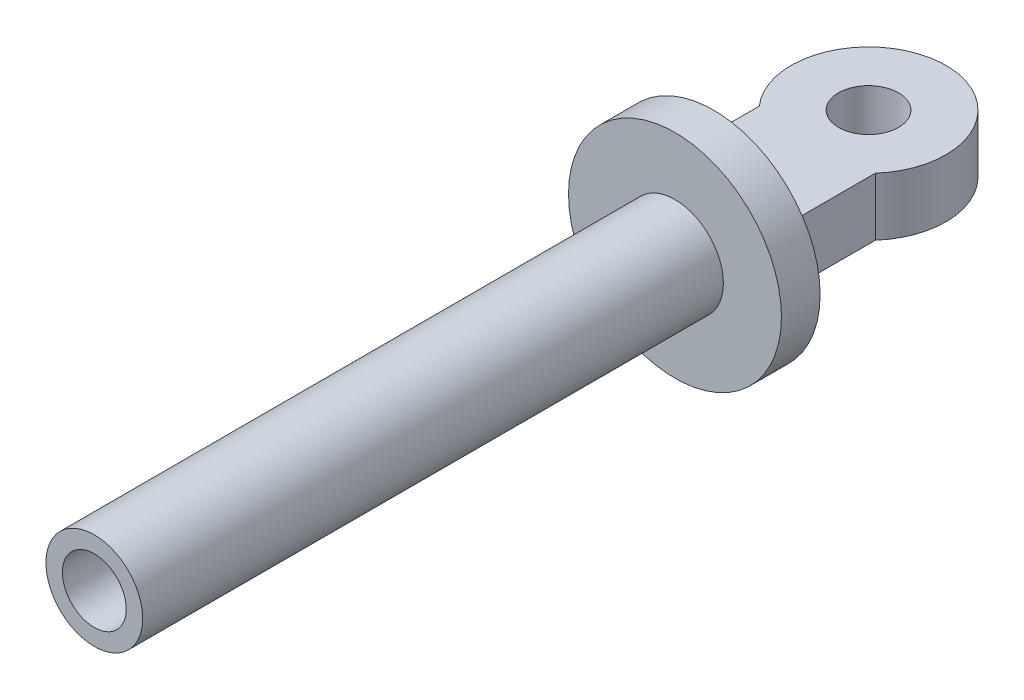
ISO-10303-21;
HEADER;
FILE_DESCRIPTION(('STEP AP214'),'2;1');
FILE_NAME('part.step','',(''),(''),'','','');
FILE_SCHEMA(('AUTOMOTIVE_DESIGN { 1 0 10303 214 1 1 1 1 }'));
ENDSEC;
DATA;
#1=APPLICATION_CONTEXT('core data for automotive mechanical design processes');
#2=APPLICATION_PROTOCOL_DEFINITION('international standard','automotive_design',2000,#1);
#3=PRODUCT_CONTEXT('',#1,'mechanical');
#4=PRODUCT('Part','Part','',(#3));
#5=PRODUCT_RELATED_PRODUCT_CATEGORY('part','',(#4));
#6=PRODUCT_DEFINITION_FORMATION('','',#4);
#7=PRODUCT_DEFINITION_CONTEXT('part definition',#1,'design');
#8=PRODUCT_DEFINITION('design','',#6,#7);
#9=PRODUCT_DEFINITION_SHAPE('','',#8);
#10=(LENGTH_UNIT() NAMED_UNIT(*) SI_UNIT(.MILLI.,.METRE.));
#11=(NAMED_UNIT(*) PLANE_ANGLE_UNIT() SI_UNIT($,.RADIAN.));
#12=(NAMED_UNIT(*) SI_UNIT($,.STERADIAN.) SOLID_ANGLE_UNIT());
#13=UNCERTAINTY_MEASURE_WITH_UNIT(LENGTH_MEASURE(1.E-05),#10,'distance_accuracy_value','');
#14=(GEOMETRIC_REPRESENTATION_CONTEXT(3) GLOBAL_UNCERTAINTY_ASSIGNED_CONTEXT((#13)) GLOBAL_UNIT_ASSIGNED_CONTEXT((#10,
#11,#12)) REPRESENTATION_CONTEXT('',''));
#15=CARTESIAN_POINT('',(0.,0.,0.));
#16=DIRECTION('',(0.,0.,1.));
#17=DIRECTION('',(1.,0.,0.));
#18=AXIS2_PLACEMENT_3D('',#15,#16,#17);
#19=CARTESIAN_POINT('',(0.,0.,25.));
#20=DIRECTION('',(0.,0.,1.));
#21=DIRECTION('',(1.,0.,0.));
#22=AXIS2_PLACEMENT_3D('',#19,#20,#21);
#23=PLANE('',#22);
#24=CARTESIAN_POINT('',(0.,0.,25.));
#25=DIRECTION('',(0.,0.,1.));
#26=DIRECTION('',(1.,0.,0.));
#27=AXIS2_PLACEMENT_3D('',#24,#25,#26);
#28=CIRCLE('',#27,3.3);
#29=CARTESIAN_POINT('',(3.3,0.,25.));
#30=VERTEX_POINT('',#29);
#31=EDGE_CURVE('E11',#30,#30,#28,.T.);
#32=ORIENTED_EDGE('',*,*,#31,.T.);
#33=EDGE_LOOP('',(#32));
#34=FACE_BOUND('',#33,.T.);
#35=ADVANCED_FACE('F16',(#34),#23,.T.);
#36=CARTESIAN_POINT('',(0.,0.,25.));
#37=DIRECTION('',(0.,0.,1.));
#38=DIRECTION('',(1.,0.,0.));
#39=AXIS2_PLACEMENT_3D('',#36,#37,#38);
#40=CYLINDRICAL_SURFACE('',#39,3.3);
#41=DIRECTION('',(0.,0.,1.));
#42=VECTOR('',#41,1.);
#43=CARTESIAN_POINT('',(3.3,0.,25.));
#44=LINE('',#43,#42);
#45=CARTESIAN_POINT('',(3.3,0.,80.));
#46=VERTEX_POINT('',#45);
#47=EDGE_CURVE('E25',#30,#46,#44,.T.);
#48=ORIENTED_EDGE('',*,*,#47,.F.);
#49=ORIENTED_EDGE('',*,*,#31,.F.);
#50=ORIENTED_EDGE('',*,*,#47,.T.);
#51=CARTESIAN_POINT('',(0.,0.,80.));
#52=DIRECTION('',(0.,0.,1.));
#53=DIRECTION('',(1.,0.,0.));
#54=AXIS2_PLACEMENT_3D('',#51,#52,#53);
#55=CIRCLE('',#54,3.3);
#56=EDGE_CURVE('E77',#46,#46,#55,.T.);
#57=ORIENTED_EDGE('',*,*,#56,.T.);
#58=EDGE_LOOP('',(#48,#49,#50,#57));
#59=FACE_BOUND('',#58,.T.);
#60=ADVANCED_FACE('F97',(#59),#40,.F.);
#61=CARTESIAN_POINT('',(0.,5.,0.));
#62=DIRECTION('',(0.,-1.,0.));
#63=DIRECTION('',(1.,0.,0.));
#64=AXIS2_PLACEMENT_3D('',#61,#62,#63);
#65=CYLINDRICAL_SURFACE('',#64,3.1);
#66=DIRECTION('',(0.,-1.,0.));
#67=VECTOR('',#66,1.);
#68=CARTESIAN_POINT('',(3.1,5.,0.));
#69=LINE('',#68,#67);
#70=CARTESIAN_POINT('',(3.1,3.,0.));
#71=VERTEX_POINT('',#70);
#72=CARTESIAN_POINT('',(3.1,-3.,0.));
#73=VERTEX_POINT('',#72);
#74=EDGE_CURVE('E70',#71,#73,#69,.T.);
#75=ORIENTED_EDGE('',*,*,#74,.F.);
#76=CARTESIAN_POINT('',(0.,3.,0.));
#77=DIRECTION('',(0.,-1.,0.));
#78=DIRECTION('',(1.,0.,0.));
#79=AXIS2_PLACEMENT_3D('',#76,#77,#78);
#80=CIRCLE('',#79,3.1);
#81=EDGE_CURVE('E73',#71,#71,#80,.T.);
#82=ORIENTED_EDGE('',*,*,#81,.F.);
#83=ORIENTED_EDGE('',*,*,#74,.T.);
#84=CARTESIAN_POINT('',(0.,-3.,0.));
#85=DIRECTION('',(0.,-1.,0.));
#86=DIRECTION('',(1.,0.,0.));
#87=AXIS2_PLACEMENT_3D('',#84,#85,#86);
#88=CIRCLE('',#87,3.1);
#89=EDGE_CURVE('E75',#73,#73,#88,.T.);
#90=ORIENTED_EDGE('',*,*,#89,.T.);
#91=EDGE_LOOP('',(#75,#82,#83,#90));
#92=FACE_BOUND('',#91,.T.);
#93=ADVANCED_FACE('F72',(#92),#65,.F.);
#94=CARTESIAN_POINT('',(0.,3.,0.));
#95=DIRECTION('',(0.,-1.,0.));
#96=DIRECTION('',(1.,0.,0.));
#97=AXIS2_PLACEMENT_3D('',#94,#95,#96);
#98=CYLINDRICAL_SURFACE('',#97,8.);
#99=CARTESIAN_POINT('',(0.,3.,0.));
#100=DIRECTION('',(0.,-1.,0.));
#101=DIRECTION('',(-0.750000000000073,0.,0.661437827766065));
#102=AXIS2_PLACEMENT_3D('',#99,#100,#101);
#103=CIRCLE('',#102,8.);
#104=CARTESIAN_POINT('',(-6.,3.,5.291502622129));
#105=VERTEX_POINT('',#104);
#106=CARTESIAN_POINT('',(6.,3.,5.291502622129));
#107=VERTEX_POINT('',#106);
#108=EDGE_CURVE('E83',#105,#107,#103,.T.);
#109=ORIENTED_EDGE('',*,*,#108,.T.);
#110=DIRECTION('',(0.,-1.,0.));
#111=VECTOR('',#110,1.);
#112=CARTESIAN_POINT('',(6.,3.,5.291502622129));
#113=LINE('',#112,#111);
#114=CARTESIAN_POINT('',(6.,-3.,5.291502622129));
#115=VERTEX_POINT('',#114);
#116=EDGE_CURVE('E145',#107,#115,#113,.T.);
#117=ORIENTED_EDGE('',*,*,#116,.T.);
#118=CARTESIAN_POINT('',(0.,-3.,0.));
#119=DIRECTION('',(0.,1.,0.));
#120=DIRECTION('',(0.750000000000073,0.,0.661437827766065));
#121=AXIS2_PLACEMENT_3D('',#118,#119,#120);
#122=CIRCLE('',#121,8.);
#123=CARTESIAN_POINT('',(-6.,-3.,5.291502622129));
#124=VERTEX_POINT('',#123);
#125=EDGE_CURVE('E133',#115,#124,#122,.T.);
#126=ORIENTED_EDGE('',*,*,#125,.T.);
#127=DIRECTION('',(0.,-1.,0.));
#128=VECTOR('',#127,1.);
#129=CARTESIAN_POINT('',(-6.,3.,5.291502622129));
#130=LINE('',#129,#128);
#131=EDGE_CURVE('E132',#105,#124,#130,.T.);
#132=ORIENTED_EDGE('',*,*,#131,.F.);
#133=EDGE_LOOP('',(#109,#117,#126,#132));
#134=FACE_BOUND('',#133,.T.);
#135=ADVANCED_FACE('F103',(#134),#98,.T.);
#136=CARTESIAN_POINT('',(0.,0.,80.));
#137=DIRECTION('',(0.,0.,1.));
#138=DIRECTION('',(1.,0.,0.));
#139=AXIS2_PLACEMENT_3D('',#136,#137,#138);
#140=PLANE('',#139);
#141=ORIENTED_EDGE('',*,*,#56,.F.);
#142=EDGE_LOOP('',(#141));
#143=FACE_BOUND('',#142,.T.);
#144=CARTESIAN_POINT('',(0.,0.,80.));
#145=DIRECTION('',(0.,0.,1.));
#146=DIRECTION('',(1.,0.,0.));
#147=AXIS2_PLACEMENT_3D('',#144,#145,#146);
#148=CIRCLE('',#147,5.);
#149=CARTESIAN_POINT('',(5.,0.,80.));
#150=VERTEX_POINT('',#149);
#151=EDGE_CURVE('E107',#150,#150,#148,.T.);
#152=ORIENTED_EDGE('',*,*,#151,.T.);
#153=EDGE_LOOP('',(#152));
#154=FACE_BOUND('',#153,.T.);
#155=ADVANCED_FACE('F100',(#143,#154),#140,.T.);
#156=CARTESIAN_POINT('',(0.,3.,0.));
#157=DIRECTION('',(0.,-1.,0.));
#158=DIRECTION('',(-1.,0.,0.));
#159=AXIS2_PLACEMENT_3D('',#156,#157,#158);
#160=PLANE('',#159);
#161=ORIENTED_EDGE('',*,*,#81,.T.);
#162=EDGE_LOOP('',(#161));
#163=FACE_BOUND('',#162,.T.);
#164=DIRECTION('',(0.,0.,1.));
#165=VECTOR('',#164,1.);
#166=CARTESIAN_POINT('',(-6.,3.,0.));
#167=LINE('',#166,#165);
#168=CARTESIAN_POINT('',(-6.,3.,16.));
#169=VERTEX_POINT('',#168);
#170=EDGE_CURVE('E121',#105,#169,#167,.T.);
#171=ORIENTED_EDGE('',*,*,#170,.T.);
#172=DIRECTION('',(1.,0.,0.));
#173=VECTOR('',#172,1.);
#174=CARTESIAN_POINT('',(-6.,3.,16.));
#175=LINE('',#174,#173);
#176=CARTESIAN_POINT('',(6.,3.,16.));
#177=VERTEX_POINT('',#176);
#178=EDGE_CURVE('E124',#169,#177,#175,.T.);
#179=ORIENTED_EDGE('',*,*,#178,.T.);
#180=DIRECTION('',(0.,0.,1.));
#181=VECTOR('',#180,1.);
#182=CARTESIAN_POINT('',(6.,3.,0.));
#183=LINE('',#182,#181);
#184=EDGE_CURVE('E90',#107,#177,#183,.T.);
#185=ORIENTED_EDGE('',*,*,#184,.F.);
#186=ORIENTED_EDGE('',*,*,#108,.F.);
#187=EDGE_LOOP('',(#171,#179,#185,#186));
#188=FACE_BOUND('',#187,.T.);
#189=ADVANCED_FACE('F80',(#163,#188),#160,.F.);
#190=CARTESIAN_POINT('',(6.,-3.,0.));
#191=DIRECTION('',(1.,0.,0.));
#192=DIRECTION('',(0.,1.,0.));
#193=AXIS2_PLACEMENT_3D('',#190,#191,#192);
#194=PLANE('',#193);
#195=DIRECTION('',(0.,0.,1.));
#196=VECTOR('',#195,1.);
#197=CARTESIAN_POINT('',(6.,-3.,0.));
#198=LINE('',#197,#196);
#199=CARTESIAN_POINT('',(6.,-3.,16.));
#200=VERTEX_POINT('',#199);
#201=EDGE_CURVE('E136',#115,#200,#198,.T.);
#202=ORIENTED_EDGE('',*,*,#201,.F.);
#203=ORIENTED_EDGE('',*,*,#116,.F.);
#204=ORIENTED_EDGE('',*,*,#184,.T.);
#205=DIRECTION('',(0.,1.,0.));
#206=VECTOR('',#205,1.);
#207=CARTESIAN_POINT('',(6.,-3.,16.));
#208=LINE('',#207,#206);
#209=EDGE_CURVE('E127',#200,#177,#208,.T.);
#210=ORIENTED_EDGE('',*,*,#209,.F.);
#211=EDGE_LOOP('',(#202,#203,#204,#210));
#212=FACE_BOUND('',#211,.T.);
#213=ADVANCED_FACE('F228',(#212),#194,.T.);
#214=CARTESIAN_POINT('',(0.,-3.,0.));
#215=DIRECTION('',(0.,-1.,0.));
#216=DIRECTION('',(-1.,0.,0.));
#217=AXIS2_PLACEMENT_3D('',#214,#215,#216);
#218=PLANE('',#217);
#219=ORIENTED_EDGE('',*,*,#89,.F.);
#220=EDGE_LOOP('',(#219));
#221=FACE_BOUND('',#220,.T.);
#222=ORIENTED_EDGE('',*,*,#125,.F.);
#223=ORIENTED_EDGE('',*,*,#201,.T.);
#224=DIRECTION('',(1.,0.,0.));
#225=VECTOR('',#224,1.);
#226=CARTESIAN_POINT('',(-6.,-3.,16.));
#227=LINE('',#226,#225);
#228=CARTESIAN_POINT('',(-6.,-3.,16.));
#229=VERTEX_POINT('',#228);
#230=EDGE_CURVE('E162',#229,#200,#227,.T.);
#231=ORIENTED_EDGE('',*,*,#230,.F.);
#232=DIRECTION('',(0.,0.,1.));
#233=VECTOR('',#232,1.);
#234=CARTESIAN_POINT('',(-6.,-3.,0.));
#235=LINE('',#234,#233);
#236=EDGE_CURVE('E137',#124,#229,#235,.T.);
#237=ORIENTED_EDGE('',*,*,#236,.F.);
#238=EDGE_LOOP('',(#222,#223,#231,#237));
#239=FACE_BOUND('',#238,.T.);
#240=ADVANCED_FACE('F225',(#221,#239),#218,.T.);
#241=CARTESIAN_POINT('',(-6.,-3.,0.));
#242=DIRECTION('',(1.,0.,0.));
#243=DIRECTION('',(0.,1.,0.));
#244=AXIS2_PLACEMENT_3D('',#241,#242,#243);
#245=PLANE('',#244);
#246=DIRECTION('',(0.,1.,0.));
#247=VECTOR('',#246,1.);
#248=CARTESIAN_POINT('',(-6.,-3.,16.));
#249=LINE('',#248,#247);
#250=EDGE_CURVE('E115',#229,#169,#249,.T.);
#251=ORIENTED_EDGE('',*,*,#250,.T.);
#252=ORIENTED_EDGE('',*,*,#170,.F.);
#253=ORIENTED_EDGE('',*,*,#131,.T.);
#254=ORIENTED_EDGE('',*,*,#236,.T.);
#255=EDGE_LOOP('',(#251,#252,#253,#254));
#256=FACE_BOUND('',#255,.T.);
#257=ADVANCED_FACE('F211',(#256),#245,.F.);
#258=CARTESIAN_POINT('',(0.,0.,20.));
#259=DIRECTION('',(0.,0.,1.));
#260=DIRECTION('',(1.,0.,0.));
#261=AXIS2_PLACEMENT_3D('',#258,#259,#260);
#262=CYLINDRICAL_SURFACE('',#261,5.);
#263=ORIENTED_EDGE('',*,*,#151,.F.);
#264=DIRECTION('',(0.,0.,1.));
#265=VECTOR('',#264,1.);
#266=CARTESIAN_POINT('',(5.,0.,20.));
#267=LINE('',#266,#265);
#268=CARTESIAN_POINT('',(5.,0.,20.));
#269=VERTEX_POINT('',#268);
#270=EDGE_CURVE('E114',#269,#150,#267,.T.);
#271=ORIENTED_EDGE('',*,*,#270,.F.);
#272=CARTESIAN_POINT('',(0.,0.,20.));
#273=DIRECTION('',(0.,0.,1.));
#274=DIRECTION('',(1.,0.,0.));
#275=AXIS2_PLACEMENT_3D('',#272,#273,#274);
#276=CIRCLE('',#275,5.);
#277=EDGE_CURVE('E166',#269,#269,#276,.T.);
#278=ORIENTED_EDGE('',*,*,#277,.T.);
#279=ORIENTED_EDGE('',*,*,#270,.T.);
#280=EDGE_LOOP('',(#263,#271,#278,#279));
#281=FACE_BOUND('',#280,.T.);
#282=ADVANCED_FACE('F201',(#281),#262,.T.);
#283=CARTESIAN_POINT('',(0.,0.,16.));
#284=DIRECTION('',(0.,0.,1.));
#285=DIRECTION('',(1.,0.,0.));
#286=AXIS2_PLACEMENT_3D('',#283,#284,#285);
#287=PLANE('',#286);
#288=ORIENTED_EDGE('',*,*,#230,.T.);
#289=ORIENTED_EDGE('',*,*,#209,.T.);
#290=ORIENTED_EDGE('',*,*,#178,.F.);
#291=ORIENTED_EDGE('',*,*,#250,.F.);
#292=EDGE_LOOP('',(#288,#289,#290,#291));
#293=FACE_BOUND('',#292,.T.);
#294=CARTESIAN_POINT('',(0.,0.,16.));
#295=DIRECTION('',(0.,0.,1.));
#296=DIRECTION('',(1.,0.,0.));
#297=AXIS2_PLACEMENT_3D('',#294,#295,#296);
#298=CIRCLE('',#297,11.);
#299=CARTESIAN_POINT('',(11.,0.,16.));
#300=VERTEX_POINT('',#299);
#301=EDGE_CURVE('E172',#300,#300,#298,.T.);
#302=ORIENTED_EDGE('',*,*,#301,.F.);
#303=EDGE_LOOP('',(#302));
#304=FACE_BOUND('',#303,.T.);
#305=ADVANCED_FACE('F199',(#293,#304),#287,.F.);
#306=CARTESIAN_POINT('',(0.,0.,20.));
#307=DIRECTION('',(0.,0.,1.));
#308=DIRECTION('',(1.,0.,0.));
#309=AXIS2_PLACEMENT_3D('',#306,#307,#308);
#310=PLANE('',#309);
#311=ORIENTED_EDGE('',*,*,#277,.F.);
#312=EDGE_LOOP('',(#311));
#313=FACE_BOUND('',#312,.T.);
#314=CARTESIAN_POINT('',(0.,0.,20.));
#315=DIRECTION('',(0.,0.,1.));
#316=DIRECTION('',(1.,0.,0.));
#317=AXIS2_PLACEMENT_3D('',#314,#315,#316);
#318=CIRCLE('',#317,11.);
#319=CARTESIAN_POINT('',(11.,0.,20.));
#320=VERTEX_POINT('',#319);
#321=EDGE_CURVE('E180',#320,#320,#318,.T.);
#322=ORIENTED_EDGE('',*,*,#321,.T.);
#323=EDGE_LOOP('',(#322));
#324=FACE_BOUND('',#323,.T.);
#325=ADVANCED_FACE('F187',(#313,#324),#310,.T.);
#326=CARTESIAN_POINT('',(0.,0.,16.));
#327=DIRECTION('',(0.,0.,1.));
#328=DIRECTION('',(1.,0.,0.));
#329=AXIS2_PLACEMENT_3D('',#326,#327,#328);
#330=CYLINDRICAL_SURFACE('',#329,11.);
#331=ORIENTED_EDGE('',*,*,#321,.F.);
#332=DIRECTION('',(0.,0.,1.));
#333=VECTOR('',#332,1.);
#334=CARTESIAN_POINT('',(11.,0.,16.));
#335=LINE('',#334,#333);
#336=EDGE_CURVE('E176',#300,#320,#335,.T.);
#337=ORIENTED_EDGE('',*,*,#336,.F.);
#338=ORIENTED_EDGE('',*,*,#301,.T.);
#339=ORIENTED_EDGE('',*,*,#336,.T.);
#340=EDGE_LOOP('',(#331,#337,#338,#339));
#341=FACE_BOUND('',#340,.T.);
#342=ADVANCED_FACE('F193',(#341),#330,.T.);
#343=CLOSED_SHELL('',(#35,#60,#93,#135,#155,#189,#213,#240,#257,#282,#305,#325,#342));
#344=MANIFOLD_SOLID_BREP('B1',#343);
#345=ADVANCED_BREP_SHAPE_REPRESENTATION('',(#18,#344),#14);
#346=SHAPE_DEFINITION_REPRESENTATION(#9,#345);
ENDSEC;
END-ISO-10303-21;
